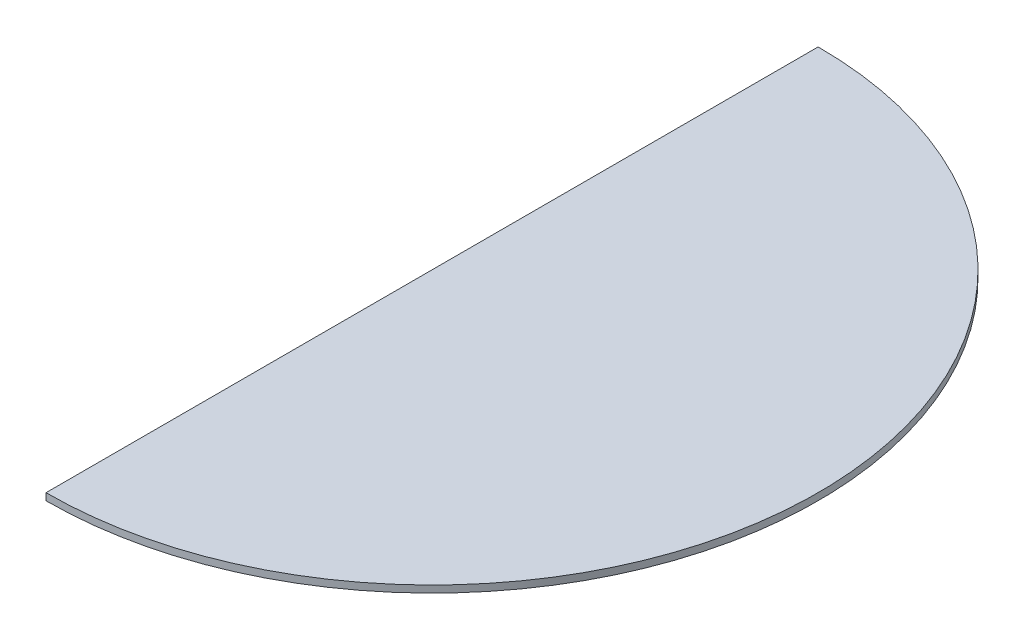
ISO-10303-21;
HEADER;
FILE_DESCRIPTION(('STEP AP214'),'2;1');
FILE_NAME('part.step','',(''),(''),'','','');
FILE_SCHEMA(('AUTOMOTIVE_DESIGN { 1 0 10303 214 1 1 1 1 }'));
ENDSEC;
DATA;
#1=APPLICATION_CONTEXT('core data for automotive mechanical design processes');
#2=APPLICATION_PROTOCOL_DEFINITION('international standard','automotive_design',2000,#1);
#3=PRODUCT_CONTEXT('',#1,'mechanical');
#4=PRODUCT('Part','Part','',(#3));
#5=PRODUCT_RELATED_PRODUCT_CATEGORY('part','',(#4));
#6=PRODUCT_DEFINITION_FORMATION('','',#4);
#7=PRODUCT_DEFINITION_CONTEXT('part definition',#1,'design');
#8=PRODUCT_DEFINITION('design','',#6,#7);
#9=PRODUCT_DEFINITION_SHAPE('','',#8);
#10=(LENGTH_UNIT() NAMED_UNIT(*) SI_UNIT(.MILLI.,.METRE.));
#11=(NAMED_UNIT(*) PLANE_ANGLE_UNIT() SI_UNIT($,.RADIAN.));
#12=(NAMED_UNIT(*) SI_UNIT($,.STERADIAN.) SOLID_ANGLE_UNIT());
#13=UNCERTAINTY_MEASURE_WITH_UNIT(LENGTH_MEASURE(1.E-05),#10,'distance_accuracy_value','');
#14=(GEOMETRIC_REPRESENTATION_CONTEXT(3) GLOBAL_UNCERTAINTY_ASSIGNED_CONTEXT((#13)) GLOBAL_UNIT_ASSIGNED_CONTEXT((#10,
#11,#12)) REPRESENTATION_CONTEXT('',''));
#15=CARTESIAN_POINT('',(0.,0.,0.));
#16=DIRECTION('',(0.,0.,1.));
#17=DIRECTION('',(1.,0.,0.));
#18=AXIS2_PLACEMENT_3D('',#15,#16,#17);
#19=CARTESIAN_POINT('',(0.,20.,0.));
#20=DIRECTION('',(0.,-1.,0.));
#21=DIRECTION('',(0.,0.,-1.));
#22=AXIS2_PLACEMENT_3D('',#19,#20,#21);
#23=CYLINDRICAL_SURFACE('',#22,1100.);
#24=CARTESIAN_POINT('',(0.,0.,0.));
#25=DIRECTION('',(0.,1.,0.));
#26=DIRECTION('',(0.,0.,-1.));
#27=AXIS2_PLACEMENT_3D('',#24,#25,#26);
#28=CIRCLE('',#27,1100.);
#29=CARTESIAN_POINT('',(1.34711147906209E-13,0.,1100.));
#30=VERTEX_POINT('',#29);
#31=CARTESIAN_POINT('',(-1.21240033115588E-13,0.,-1100.));
#32=VERTEX_POINT('',#31);
#33=EDGE_CURVE('E65',#30,#32,#28,.T.);
#34=ORIENTED_EDGE('',*,*,#33,.T.);
#35=DIRECTION('',(0.,-1.,0.));
#36=VECTOR('',#35,1.);
#37=CARTESIAN_POINT('',(-1.21240033115588E-13,20.,-1100.));
#38=LINE('',#37,#36);
#39=CARTESIAN_POINT('',(-1.21240033115588E-13,20.,-1100.));
#40=VERTEX_POINT('',#39);
#41=EDGE_CURVE('E45',#40,#32,#38,.T.);
#42=ORIENTED_EDGE('',*,*,#41,.F.);
#43=CARTESIAN_POINT('',(0.,20.,0.));
#44=DIRECTION('',(0.,1.,0.));
#45=DIRECTION('',(0.,0.,-1.));
#46=AXIS2_PLACEMENT_3D('',#43,#44,#45);
#47=CIRCLE('',#46,1100.);
#48=CARTESIAN_POINT('',(1.34711147906209E-13,20.,1100.));
#49=VERTEX_POINT('',#48);
#50=EDGE_CURVE('E69',#49,#40,#47,.T.);
#51=ORIENTED_EDGE('',*,*,#50,.F.);
#52=DIRECTION('',(0.,-1.,0.));
#53=VECTOR('',#52,1.);
#54=CARTESIAN_POINT('',(1.34711147906209E-13,20.,1100.));
#55=LINE('',#54,#53);
#56=EDGE_CURVE('E11',#49,#30,#55,.T.);
#57=ORIENTED_EDGE('',*,*,#56,.T.);
#58=EDGE_LOOP('',(#34,#42,#51,#57));
#59=FACE_BOUND('',#58,.T.);
#60=ADVANCED_FACE('F37',(#59),#23,.T.);
#61=CARTESIAN_POINT('',(-1.21240033115588E-13,20.,-1100.));
#62=DIRECTION('',(1.,0.,0.));
#63=DIRECTION('',(0.,0.,-1.));
#64=AXIS2_PLACEMENT_3D('',#61,#62,#63);
#65=PLANE('',#64);
#66=DIRECTION('',(0.,0.,1.));
#67=VECTOR('',#66,1.);
#68=CARTESIAN_POINT('',(-1.21240033115588E-13,0.,-1100.));
#69=LINE('',#68,#67);
#70=EDGE_CURVE('E60',#32,#30,#69,.T.);
#71=ORIENTED_EDGE('',*,*,#70,.T.);
#72=ORIENTED_EDGE('',*,*,#56,.F.);
#73=DIRECTION('',(0.,0.,1.));
#74=VECTOR('',#73,1.);
#75=CARTESIAN_POINT('',(0.,20.,0.));
#76=LINE('',#75,#74);
#77=EDGE_CURVE('E53',#40,#49,#76,.T.);
#78=ORIENTED_EDGE('',*,*,#77,.F.);
#79=ORIENTED_EDGE('',*,*,#41,.T.);
#80=EDGE_LOOP('',(#71,#72,#78,#79));
#81=FACE_BOUND('',#80,.T.);
#82=ADVANCED_FACE('F68',(#81),#65,.F.);
#83=CARTESIAN_POINT('',(0.,20.,0.));
#84=DIRECTION('',(0.,-1.,0.));
#85=DIRECTION('',(0.,0.,-1.));
#86=AXIS2_PLACEMENT_3D('',#83,#84,#85);
#87=PLANE('',#86);
#88=ORIENTED_EDGE('',*,*,#77,.T.);
#89=ORIENTED_EDGE('',*,*,#50,.T.);
#90=EDGE_LOOP('',(#88,#89));
#91=FACE_BOUND('',#90,.T.);
#92=ADVANCED_FACE('F75',(#91),#87,.F.);
#93=CARTESIAN_POINT('',(0.,0.,0.));
#94=DIRECTION('',(0.,-1.,0.));
#95=DIRECTION('',(0.,0.,-1.));
#96=AXIS2_PLACEMENT_3D('',#93,#94,#95);
#97=PLANE('',#96);
#98=ORIENTED_EDGE('',*,*,#33,.F.);
#99=ORIENTED_EDGE('',*,*,#70,.F.);
#100=EDGE_LOOP('',(#98,#99));
#101=FACE_BOUND('',#100,.T.);
#102=ADVANCED_FACE('F70',(#101),#97,.T.);
#103=CLOSED_SHELL('',(#60,#82,#92,#102));
#104=MANIFOLD_SOLID_BREP('B2',#103);
#105=ADVANCED_BREP_SHAPE_REPRESENTATION('',(#18,#104),#14);
#106=SHAPE_DEFINITION_REPRESENTATION(#9,#105);
ENDSEC;
END-ISO-10303-21;
